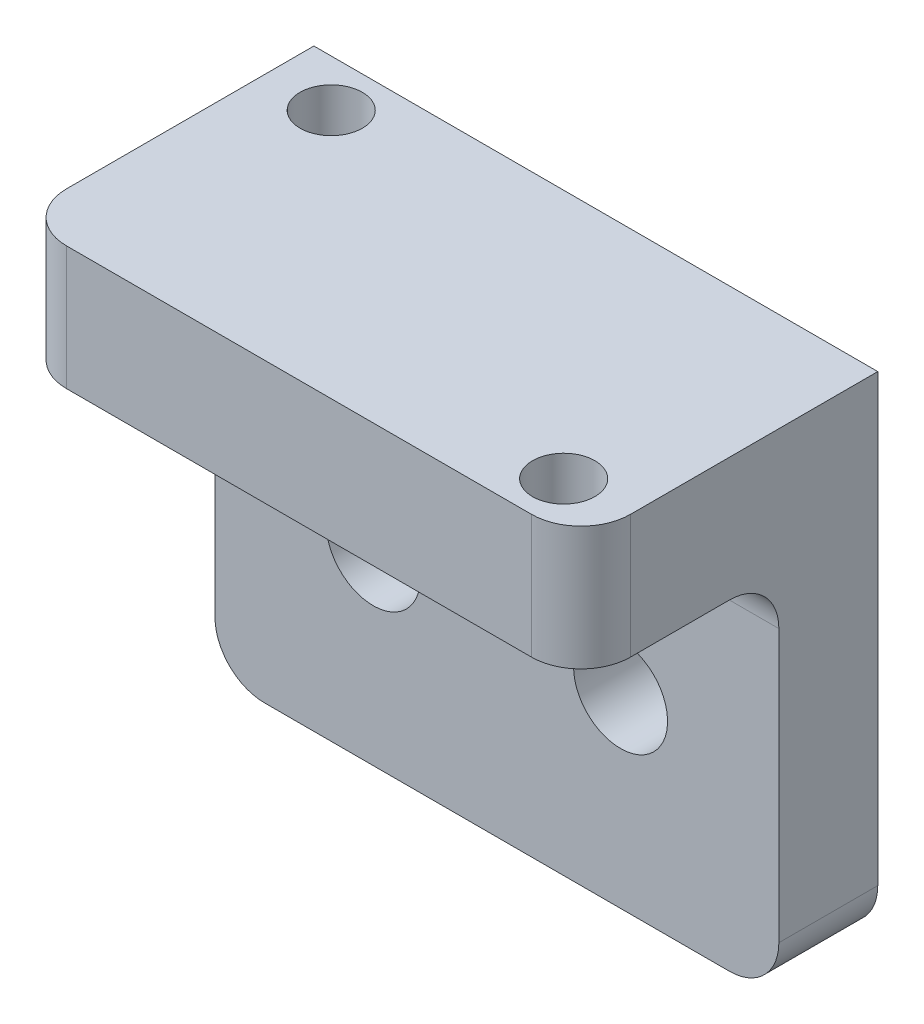
ISO-10303-21;
HEADER;
FILE_DESCRIPTION(('STEP AP214'),'2;1');
FILE_NAME('part.step','',(''),(''),'','','');
FILE_SCHEMA(('AUTOMOTIVE_DESIGN { 1 0 10303 214 1 1 1 1 }'));
ENDSEC;
DATA;
#1=APPLICATION_CONTEXT('core data for automotive mechanical design processes');
#2=APPLICATION_PROTOCOL_DEFINITION('international standard','automotive_design',2000,#1);
#3=PRODUCT_CONTEXT('',#1,'mechanical');
#4=PRODUCT('Part','Part','',(#3));
#5=PRODUCT_RELATED_PRODUCT_CATEGORY('part','',(#4));
#6=PRODUCT_DEFINITION_FORMATION('','',#4);
#7=PRODUCT_DEFINITION_CONTEXT('part definition',#1,'design');
#8=PRODUCT_DEFINITION('design','',#6,#7);
#9=PRODUCT_DEFINITION_SHAPE('','',#8);
#10=(LENGTH_UNIT() NAMED_UNIT(*) SI_UNIT(.MILLI.,.METRE.));
#11=(NAMED_UNIT(*) PLANE_ANGLE_UNIT() SI_UNIT($,.RADIAN.));
#12=(NAMED_UNIT(*) SI_UNIT($,.STERADIAN.) SOLID_ANGLE_UNIT());
#13=UNCERTAINTY_MEASURE_WITH_UNIT(LENGTH_MEASURE(1.E-05),#10,'distance_accuracy_value','');
#14=(GEOMETRIC_REPRESENTATION_CONTEXT(3) GLOBAL_UNCERTAINTY_ASSIGNED_CONTEXT((#13)) GLOBAL_UNIT_ASSIGNED_CONTEXT((#10,
#11,#12)) REPRESENTATION_CONTEXT('',''));
#15=CARTESIAN_POINT('',(0.,0.,0.));
#16=DIRECTION('',(0.,0.,1.));
#17=DIRECTION('',(1.,0.,0.));
#18=AXIS2_PLACEMENT_3D('',#15,#16,#17);
#19=CARTESIAN_POINT('',(0.,-6.35,0.));
#20=DIRECTION('',(0.,-1.,0.));
#21=DIRECTION('',(0.,0.,-1.));
#22=AXIS2_PLACEMENT_3D('',#19,#20,#21);
#23=PLANE('',#22);
#24=CARTESIAN_POINT('',(11.176,-6.35,5.207));
#25=DIRECTION('',(0.,1.,0.));
#26=DIRECTION('',(0.,0.,1.));
#27=AXIS2_PLACEMENT_3D('',#24,#25,#26);
#28=CIRCLE('',#27,1.6002);
#29=CARTESIAN_POINT('',(11.176,-6.35,6.8072));
#30=VERTEX_POINT('',#29);
#31=EDGE_CURVE('E221',#30,#30,#28,.T.);
#32=ORIENTED_EDGE('',*,*,#31,.T.);
#33=EDGE_LOOP('',(#32));
#34=FACE_BOUND('',#33,.T.);
#35=DIRECTION('',(0.,0.,-1.));
#36=VECTOR('',#35,1.);
#37=CARTESIAN_POINT('',(14.478,-6.35,7.62));
#38=LINE('',#37,#36);
#39=CARTESIAN_POINT('',(14.478,-6.35,5.08));
#40=VERTEX_POINT('',#39);
#41=CARTESIAN_POINT('',(14.478,-6.35,0.));
#42=VERTEX_POINT('',#41);
#43=EDGE_CURVE('E154',#40,#42,#38,.T.);
#44=ORIENTED_EDGE('',*,*,#43,.F.);
#45=CARTESIAN_POINT('',(11.938,-6.35,5.08));
#46=DIRECTION('',(0.,-1.,0.));
#47=DIRECTION('',(0.,0.,-1.));
#48=AXIS2_PLACEMENT_3D('',#45,#46,#47);
#49=CIRCLE('',#48,2.54);
#50=CARTESIAN_POINT('',(11.938,-6.35,7.62));
#51=VERTEX_POINT('',#50);
#52=EDGE_CURVE('E51',#40,#51,#49,.T.);
#53=ORIENTED_EDGE('',*,*,#52,.T.);
#54=DIRECTION('',(1.,0.,0.));
#55=VECTOR('',#54,1.);
#56=CARTESIAN_POINT('',(-14.478,-6.35,7.62));
#57=LINE('',#56,#55);
#58=CARTESIAN_POINT('',(-11.938,-6.35,7.62));
#59=VERTEX_POINT('',#58);
#60=EDGE_CURVE('E132',#59,#51,#57,.T.);
#61=ORIENTED_EDGE('',*,*,#60,.F.);
#62=CARTESIAN_POINT('',(-11.938,-6.35,5.08));
#63=DIRECTION('',(0.,-1.,0.));
#64=DIRECTION('',(0.,0.,-1.));
#65=AXIS2_PLACEMENT_3D('',#62,#63,#64);
#66=CIRCLE('',#65,2.54);
#67=CARTESIAN_POINT('',(-14.478,-6.35,5.08));
#68=VERTEX_POINT('',#67);
#69=EDGE_CURVE('E189',#59,#68,#66,.T.);
#70=ORIENTED_EDGE('',*,*,#69,.T.);
#71=DIRECTION('',(0.,0.,1.));
#72=VECTOR('',#71,1.);
#73=CARTESIAN_POINT('',(-14.478,-6.35,7.62));
#74=LINE('',#73,#72);
#75=CARTESIAN_POINT('',(-14.478,-6.35,0.));
#76=VERTEX_POINT('',#75);
#77=EDGE_CURVE('E211',#76,#68,#74,.T.);
#78=ORIENTED_EDGE('',*,*,#77,.F.);
#79=DIRECTION('',(1.,0.,0.));
#80=VECTOR('',#79,1.);
#81=CARTESIAN_POINT('',(0.,-6.35,0.));
#82=LINE('',#81,#80);
#83=EDGE_CURVE('E186',#76,#42,#82,.T.);
#84=ORIENTED_EDGE('',*,*,#83,.T.);
#85=EDGE_LOOP('',(#44,#53,#61,#70,#78,#84));
#86=FACE_BOUND('',#85,.T.);
#87=ADVANCED_FACE('F36',(#34,#86),#23,.T.);
#88=CARTESIAN_POINT('',(14.478,-6.35,7.62));
#89=DIRECTION('',(1.,0.,0.));
#90=DIRECTION('',(0.,0.,-1.));
#91=AXIS2_PLACEMENT_3D('',#88,#89,#90);
#92=PLANE('',#91);
#93=DIRECTION('',(0.,-1.,0.));
#94=VECTOR('',#93,1.);
#95=CARTESIAN_POINT('',(14.478,-6.35,-2.54));
#96=LINE('',#95,#94);
#97=CARTESIAN_POINT('',(14.478,-8.89,-2.54));
#98=VERTEX_POINT('',#97);
#99=CARTESIAN_POINT('',(14.478,-22.86,-2.54));
#100=VERTEX_POINT('',#99);
#101=EDGE_CURVE('E193',#98,#100,#96,.T.);
#102=ORIENTED_EDGE('',*,*,#101,.T.);
#103=DIRECTION('',(0.,0.,-1.));
#104=VECTOR('',#103,1.);
#105=CARTESIAN_POINT('',(14.478,-22.86,7.62));
#106=LINE('',#105,#104);
#107=CARTESIAN_POINT('',(14.478,-22.86,-7.62));
#108=VERTEX_POINT('',#107);
#109=EDGE_CURVE('E128',#100,#108,#106,.T.);
#110=ORIENTED_EDGE('',*,*,#109,.T.);
#111=DIRECTION('',(0.,1.,0.));
#112=VECTOR('',#111,1.);
#113=CARTESIAN_POINT('',(14.478,-6.35,-7.62));
#114=LINE('',#113,#112);
#115=CARTESIAN_POINT('',(14.478,0.,-7.62));
#116=VERTEX_POINT('',#115);
#117=EDGE_CURVE('E121',#108,#116,#114,.T.);
#118=ORIENTED_EDGE('',*,*,#117,.T.);
#119=DIRECTION('',(0.,0.,-1.));
#120=VECTOR('',#119,1.);
#121=CARTESIAN_POINT('',(14.478,0.,7.62));
#122=LINE('',#121,#120);
#123=CARTESIAN_POINT('',(14.478,0.,5.08));
#124=VERTEX_POINT('',#123);
#125=EDGE_CURVE('E125',#124,#116,#122,.T.);
#126=ORIENTED_EDGE('',*,*,#125,.F.);
#127=DIRECTION('',(0.,1.,0.));
#128=VECTOR('',#127,1.);
#129=CARTESIAN_POINT('',(14.478,-6.35,5.08));
#130=LINE('',#129,#128);
#131=EDGE_CURVE('E155',#124,#40,#130,.F.);
#132=ORIENTED_EDGE('',*,*,#131,.T.);
#133=ORIENTED_EDGE('',*,*,#43,.T.);
#134=CARTESIAN_POINT('',(14.478,-8.89,0.));
#135=DIRECTION('',(1.,0.,0.));
#136=DIRECTION('',(0.,0.,-1.));
#137=AXIS2_PLACEMENT_3D('',#134,#135,#136);
#138=CIRCLE('',#137,2.54);
#139=EDGE_CURVE('E44',#42,#98,#138,.F.);
#140=ORIENTED_EDGE('',*,*,#139,.T.);
#141=EDGE_LOOP('',(#102,#110,#118,#126,#132,#133,#140));
#142=FACE_BOUND('',#141,.T.);
#143=ADVANCED_FACE('F124',(#142),#92,.T.);
#144=CARTESIAN_POINT('',(-14.478,-6.35,7.62));
#145=DIRECTION('',(0.,0.,1.));
#146=DIRECTION('',(1.,0.,0.));
#147=AXIS2_PLACEMENT_3D('',#144,#145,#146);
#148=PLANE('',#147);
#149=ORIENTED_EDGE('',*,*,#60,.T.);
#150=DIRECTION('',(0.,1.,0.));
#151=VECTOR('',#150,1.);
#152=CARTESIAN_POINT('',(11.938,-6.35,7.62));
#153=LINE('',#152,#151);
#154=CARTESIAN_POINT('',(11.938,0.,7.62));
#155=VERTEX_POINT('',#154);
#156=EDGE_CURVE('E180',#51,#155,#153,.T.);
#157=ORIENTED_EDGE('',*,*,#156,.T.);
#158=DIRECTION('',(1.,0.,0.));
#159=VECTOR('',#158,1.);
#160=CARTESIAN_POINT('',(-14.478,0.,7.62));
#161=LINE('',#160,#159);
#162=CARTESIAN_POINT('',(-11.938,0.,7.62));
#163=VERTEX_POINT('',#162);
#164=EDGE_CURVE('E149',#163,#155,#161,.T.);
#165=ORIENTED_EDGE('',*,*,#164,.F.);
#166=DIRECTION('',(0.,1.,0.));
#167=VECTOR('',#166,1.);
#168=CARTESIAN_POINT('',(-11.938,-6.35,7.62));
#169=LINE('',#168,#167);
#170=EDGE_CURVE('E58',#163,#59,#169,.F.);
#171=ORIENTED_EDGE('',*,*,#170,.T.);
#172=EDGE_LOOP('',(#149,#157,#165,#171));
#173=FACE_BOUND('',#172,.T.);
#174=ADVANCED_FACE('F276',(#173),#148,.T.);
#175=CARTESIAN_POINT('',(-14.478,-6.35,7.62));
#176=DIRECTION('',(-1.,0.,0.));
#177=DIRECTION('',(0.,0.,1.));
#178=AXIS2_PLACEMENT_3D('',#175,#176,#177);
#179=PLANE('',#178);
#180=DIRECTION('',(0.,1.,0.));
#181=VECTOR('',#180,1.);
#182=CARTESIAN_POINT('',(-14.478,-6.35,-7.62));
#183=LINE('',#182,#181);
#184=CARTESIAN_POINT('',(-14.478,-22.86,-7.62));
#185=VERTEX_POINT('',#184);
#186=CARTESIAN_POINT('',(-14.478,0.,-7.62));
#187=VERTEX_POINT('',#186);
#188=EDGE_CURVE('E131',#185,#187,#183,.T.);
#189=ORIENTED_EDGE('',*,*,#188,.F.);
#190=DIRECTION('',(0.,0.,-1.));
#191=VECTOR('',#190,1.);
#192=CARTESIAN_POINT('',(-14.478,-22.86,7.62));
#193=LINE('',#192,#191);
#194=CARTESIAN_POINT('',(-14.478,-22.86,-2.54));
#195=VERTEX_POINT('',#194);
#196=EDGE_CURVE('E177',#185,#195,#193,.F.);
#197=ORIENTED_EDGE('',*,*,#196,.T.);
#198=DIRECTION('',(0.,1.,0.));
#199=VECTOR('',#198,1.);
#200=CARTESIAN_POINT('',(-14.478,-6.35,-2.54));
#201=LINE('',#200,#199);
#202=CARTESIAN_POINT('',(-14.478,-8.89,-2.54));
#203=VERTEX_POINT('',#202);
#204=EDGE_CURVE('E213',#195,#203,#201,.T.);
#205=ORIENTED_EDGE('',*,*,#204,.T.);
#206=CARTESIAN_POINT('',(-14.478,-8.89,0.));
#207=DIRECTION('',(-1.,0.,0.));
#208=DIRECTION('',(0.,0.,1.));
#209=AXIS2_PLACEMENT_3D('',#206,#207,#208);
#210=CIRCLE('',#209,2.54);
#211=EDGE_CURVE('E11',#203,#76,#210,.F.);
#212=ORIENTED_EDGE('',*,*,#211,.T.);
#213=ORIENTED_EDGE('',*,*,#77,.T.);
#214=DIRECTION('',(0.,1.,0.));
#215=VECTOR('',#214,1.);
#216=CARTESIAN_POINT('',(-14.478,-6.35,5.08));
#217=LINE('',#216,#215);
#218=CARTESIAN_POINT('',(-14.478,0.,5.08));
#219=VERTEX_POINT('',#218);
#220=EDGE_CURVE('E174',#68,#219,#217,.T.);
#221=ORIENTED_EDGE('',*,*,#220,.T.);
#222=DIRECTION('',(0.,0.,1.));
#223=VECTOR('',#222,1.);
#224=CARTESIAN_POINT('',(-14.478,0.,7.62));
#225=LINE('',#224,#223);
#226=EDGE_CURVE('E147',#187,#219,#225,.T.);
#227=ORIENTED_EDGE('',*,*,#226,.F.);
#228=EDGE_LOOP('',(#189,#197,#205,#212,#213,#221,#227));
#229=FACE_BOUND('',#228,.T.);
#230=ADVANCED_FACE('F210',(#229),#179,.T.);
#231=CARTESIAN_POINT('',(-14.478,-6.35,-7.62));
#232=DIRECTION('',(0.,0.,-1.));
#233=DIRECTION('',(-1.,0.,0.));
#234=AXIS2_PLACEMENT_3D('',#231,#232,#233);
#235=PLANE('',#234);
#236=ORIENTED_EDGE('',*,*,#117,.F.);
#237=CARTESIAN_POINT('',(11.938,-22.86,-7.62));
#238=DIRECTION('',(0.,0.,-1.));
#239=DIRECTION('',(-1.,0.,0.));
#240=AXIS2_PLACEMENT_3D('',#237,#238,#239);
#241=CIRCLE('',#240,2.54);
#242=CARTESIAN_POINT('',(11.938,-25.4,-7.62));
#243=VERTEX_POINT('',#242);
#244=EDGE_CURVE('E161',#108,#243,#241,.T.);
#245=ORIENTED_EDGE('',*,*,#244,.T.);
#246=DIRECTION('',(-1.,0.,0.));
#247=VECTOR('',#246,1.);
#248=CARTESIAN_POINT('',(14.478,-25.4,-7.62));
#249=LINE('',#248,#247);
#250=CARTESIAN_POINT('',(-11.938,-25.4,-7.62));
#251=VERTEX_POINT('',#250);
#252=EDGE_CURVE('E204',#243,#251,#249,.T.);
#253=ORIENTED_EDGE('',*,*,#252,.T.);
#254=CARTESIAN_POINT('',(-11.938,-22.86,-7.62));
#255=DIRECTION('',(0.,0.,-1.));
#256=DIRECTION('',(-1.,0.,0.));
#257=AXIS2_PLACEMENT_3D('',#254,#255,#256);
#258=CIRCLE('',#257,2.54);
#259=EDGE_CURVE('E159',#251,#185,#258,.T.);
#260=ORIENTED_EDGE('',*,*,#259,.T.);
#261=ORIENTED_EDGE('',*,*,#188,.T.);
#262=DIRECTION('',(-1.,0.,0.));
#263=VECTOR('',#262,1.);
#264=CARTESIAN_POINT('',(-14.478,0.,-7.62));
#265=LINE('',#264,#263);
#266=EDGE_CURVE('E139',#116,#187,#265,.T.);
#267=ORIENTED_EDGE('',*,*,#266,.F.);
#268=EDGE_LOOP('',(#236,#245,#253,#260,#261,#267));
#269=FACE_BOUND('',#268,.T.);
#270=CARTESIAN_POINT('',(-6.35,-15.875,-7.62));
#271=DIRECTION('',(0.,0.,-1.));
#272=DIRECTION('',(-1.,0.,0.));
#273=AXIS2_PLACEMENT_3D('',#270,#271,#272);
#274=CIRCLE('',#273,2.413);
#275=CARTESIAN_POINT('',(-8.763,-15.875,-7.62));
#276=VERTEX_POINT('',#275);
#277=EDGE_CURVE('E241',#276,#276,#274,.T.);
#278=ORIENTED_EDGE('',*,*,#277,.F.);
#279=EDGE_LOOP('',(#278));
#280=FACE_BOUND('',#279,.T.);
#281=CARTESIAN_POINT('',(6.35,-15.875,-7.62));
#282=DIRECTION('',(0.,0.,-1.));
#283=DIRECTION('',(-1.,0.,0.));
#284=AXIS2_PLACEMENT_3D('',#281,#282,#283);
#285=CIRCLE('',#284,2.413);
#286=CARTESIAN_POINT('',(3.937,-15.875,-7.62));
#287=VERTEX_POINT('',#286);
#288=EDGE_CURVE('E235',#287,#287,#285,.T.);
#289=ORIENTED_EDGE('',*,*,#288,.F.);
#290=EDGE_LOOP('',(#289));
#291=FACE_BOUND('',#290,.T.);
#292=ADVANCED_FACE('F143',(#269,#280,#291),#235,.T.);
#293=CARTESIAN_POINT('',(0.,0.,0.));
#294=DIRECTION('',(0.,-1.,0.));
#295=DIRECTION('',(0.,0.,-1.));
#296=AXIS2_PLACEMENT_3D('',#293,#294,#295);
#297=PLANE('',#296);
#298=CARTESIAN_POINT('',(11.176,0.,5.207));
#299=DIRECTION('',(0.,1.,0.));
#300=DIRECTION('',(0.,0.,1.));
#301=AXIS2_PLACEMENT_3D('',#298,#299,#300);
#302=CIRCLE('',#301,1.6002);
#303=CARTESIAN_POINT('',(11.176,0.,6.8072));
#304=VERTEX_POINT('',#303);
#305=EDGE_CURVE('E224',#304,#304,#302,.T.);
#306=ORIENTED_EDGE('',*,*,#305,.F.);
#307=EDGE_LOOP('',(#306));
#308=FACE_BOUND('',#307,.T.);
#309=CARTESIAN_POINT('',(-11.176,0.,-5.207));
#310=DIRECTION('',(0.,1.,0.));
#311=DIRECTION('',(0.,0.,1.));
#312=AXIS2_PLACEMENT_3D('',#309,#310,#311);
#313=CIRCLE('',#312,1.6002);
#314=CARTESIAN_POINT('',(-11.176,0.,-3.6068));
#315=VERTEX_POINT('',#314);
#316=EDGE_CURVE('E218',#315,#315,#313,.T.);
#317=ORIENTED_EDGE('',*,*,#316,.F.);
#318=EDGE_LOOP('',(#317));
#319=FACE_BOUND('',#318,.T.);
#320=ORIENTED_EDGE('',*,*,#164,.T.);
#321=CARTESIAN_POINT('',(11.938,0.,5.08));
#322=DIRECTION('',(0.,-1.,0.));
#323=DIRECTION('',(0.,0.,-1.));
#324=AXIS2_PLACEMENT_3D('',#321,#322,#323);
#325=CIRCLE('',#324,2.54);
#326=EDGE_CURVE('E140',#155,#124,#325,.F.);
#327=ORIENTED_EDGE('',*,*,#326,.T.);
#328=ORIENTED_EDGE('',*,*,#125,.T.);
#329=ORIENTED_EDGE('',*,*,#266,.T.);
#330=ORIENTED_EDGE('',*,*,#226,.T.);
#331=CARTESIAN_POINT('',(-11.938,0.,5.08));
#332=DIRECTION('',(0.,-1.,0.));
#333=DIRECTION('',(0.,0.,-1.));
#334=AXIS2_PLACEMENT_3D('',#331,#332,#333);
#335=CIRCLE('',#334,2.54);
#336=EDGE_CURVE('E183',#219,#163,#335,.F.);
#337=ORIENTED_EDGE('',*,*,#336,.T.);
#338=EDGE_LOOP('',(#320,#327,#328,#329,#330,#337));
#339=FACE_BOUND('',#338,.T.);
#340=ADVANCED_FACE('F137',(#308,#319,#339),#297,.F.);
#341=CARTESIAN_POINT('',(-11.176,-6.35,-5.207));
#342=DIRECTION('',(0.,1.,0.));
#343=DIRECTION('',(0.,0.,1.));
#344=AXIS2_PLACEMENT_3D('',#341,#342,#343);
#345=CYLINDRICAL_SURFACE('',#344,1.6002);
#346=CARTESIAN_POINT('',(-11.176,-6.35,-5.207));
#347=DIRECTION('',(0.,1.,0.));
#348=DIRECTION('',(0.,0.,1.));
#349=AXIS2_PLACEMENT_3D('',#346,#347,#348);
#350=CIRCLE('',#349,1.6002);
#351=CARTESIAN_POINT('',(-11.176,-6.35,-3.6068));
#352=VERTEX_POINT('',#351);
#353=EDGE_CURVE('E141',#352,#352,#350,.T.);
#354=ORIENTED_EDGE('',*,*,#353,.F.);
#355=EDGE_LOOP('',(#354));
#356=FACE_BOUND('',#355,.T.);
#357=ORIENTED_EDGE('',*,*,#316,.T.);
#358=EDGE_LOOP('',(#357));
#359=FACE_BOUND('',#358,.T.);
#360=ADVANCED_FACE('F280',(#356,#359),#345,.F.);
#361=CARTESIAN_POINT('',(11.176,-6.35,5.207));
#362=DIRECTION('',(0.,1.,0.));
#363=DIRECTION('',(0.,0.,1.));
#364=AXIS2_PLACEMENT_3D('',#361,#362,#363);
#365=CYLINDRICAL_SURFACE('',#364,1.6002);
#366=ORIENTED_EDGE('',*,*,#31,.F.);
#367=EDGE_LOOP('',(#366));
#368=FACE_BOUND('',#367,.T.);
#369=ORIENTED_EDGE('',*,*,#305,.T.);
#370=EDGE_LOOP('',(#369));
#371=FACE_BOUND('',#370,.T.);
#372=ADVANCED_FACE('F253',(#368,#371),#365,.F.);
#373=CARTESIAN_POINT('',(-6.35,-15.875,-2.54));
#374=DIRECTION('',(0.,0.,-1.));
#375=DIRECTION('',(-1.,0.,0.));
#376=AXIS2_PLACEMENT_3D('',#373,#374,#375);
#377=CYLINDRICAL_SURFACE('',#376,2.413);
#378=CARTESIAN_POINT('',(-6.35,-15.875,-2.54));
#379=DIRECTION('',(0.,0.,-1.));
#380=DIRECTION('',(-1.,0.,0.));
#381=AXIS2_PLACEMENT_3D('',#378,#379,#380);
#382=CIRCLE('',#381,2.413);
#383=CARTESIAN_POINT('',(-8.763,-15.875,-2.54));
#384=VERTEX_POINT('',#383);
#385=EDGE_CURVE('E238',#384,#384,#382,.T.);
#386=ORIENTED_EDGE('',*,*,#385,.F.);
#387=EDGE_LOOP('',(#386));
#388=FACE_BOUND('',#387,.T.);
#389=ORIENTED_EDGE('',*,*,#277,.T.);
#390=EDGE_LOOP('',(#389));
#391=FACE_BOUND('',#390,.T.);
#392=ADVANCED_FACE('F249',(#388,#391),#377,.F.);
#393=CARTESIAN_POINT('',(6.35,-15.875,-2.54));
#394=DIRECTION('',(0.,0.,-1.));
#395=DIRECTION('',(-1.,0.,0.));
#396=AXIS2_PLACEMENT_3D('',#393,#394,#395);
#397=CYLINDRICAL_SURFACE('',#396,2.413);
#398=CARTESIAN_POINT('',(6.35,-15.875,-2.54));
#399=DIRECTION('',(0.,0.,-1.));
#400=DIRECTION('',(-1.,0.,0.));
#401=AXIS2_PLACEMENT_3D('',#398,#399,#400);
#402=CIRCLE('',#401,2.413);
#403=CARTESIAN_POINT('',(3.937,-15.875,-2.54));
#404=VERTEX_POINT('',#403);
#405=EDGE_CURVE('E231',#404,#404,#402,.T.);
#406=ORIENTED_EDGE('',*,*,#405,.F.);
#407=EDGE_LOOP('',(#406));
#408=FACE_BOUND('',#407,.T.);
#409=ORIENTED_EDGE('',*,*,#288,.T.);
#410=EDGE_LOOP('',(#409));
#411=FACE_BOUND('',#410,.T.);
#412=ADVANCED_FACE('F252',(#408,#411),#397,.F.);
#413=CARTESIAN_POINT('',(0.,0.,-2.54));
#414=DIRECTION('',(0.,0.,-1.));
#415=DIRECTION('',(-1.,0.,0.));
#416=AXIS2_PLACEMENT_3D('',#413,#414,#415);
#417=PLANE('',#416);
#418=ORIENTED_EDGE('',*,*,#385,.T.);
#419=EDGE_LOOP('',(#418));
#420=FACE_BOUND('',#419,.T.);
#421=ORIENTED_EDGE('',*,*,#405,.T.);
#422=EDGE_LOOP('',(#421));
#423=FACE_BOUND('',#422,.T.);
#424=DIRECTION('',(-1.,0.,0.));
#425=VECTOR('',#424,1.);
#426=CARTESIAN_POINT('',(14.478,-25.4,-2.54));
#427=LINE('',#426,#425);
#428=CARTESIAN_POINT('',(11.938,-25.4,-2.54));
#429=VERTEX_POINT('',#428);
#430=CARTESIAN_POINT('',(-11.938,-25.4,-2.54));
#431=VERTEX_POINT('',#430);
#432=EDGE_CURVE('E203',#429,#431,#427,.T.);
#433=ORIENTED_EDGE('',*,*,#432,.F.);
#434=CARTESIAN_POINT('',(11.938,-22.86,-2.54));
#435=DIRECTION('',(0.,0.,-1.));
#436=DIRECTION('',(-1.,0.,0.));
#437=AXIS2_PLACEMENT_3D('',#434,#435,#436);
#438=CIRCLE('',#437,2.54);
#439=EDGE_CURVE('E172',#429,#100,#438,.F.);
#440=ORIENTED_EDGE('',*,*,#439,.T.);
#441=ORIENTED_EDGE('',*,*,#101,.F.);
#442=DIRECTION('',(1.,0.,0.));
#443=VECTOR('',#442,1.);
#444=CARTESIAN_POINT('',(0.,-8.89,-2.54));
#445=LINE('',#444,#443);
#446=EDGE_CURVE('E168',#98,#203,#445,.F.);
#447=ORIENTED_EDGE('',*,*,#446,.T.);
#448=ORIENTED_EDGE('',*,*,#204,.F.);
#449=CARTESIAN_POINT('',(-11.938,-22.86,-2.54));
#450=DIRECTION('',(0.,0.,-1.));
#451=DIRECTION('',(-1.,0.,0.));
#452=AXIS2_PLACEMENT_3D('',#449,#450,#451);
#453=CIRCLE('',#452,2.54);
#454=EDGE_CURVE('E170',#195,#431,#453,.F.);
#455=ORIENTED_EDGE('',*,*,#454,.T.);
#456=EDGE_LOOP('',(#433,#440,#441,#447,#448,#455));
#457=FACE_BOUND('',#456,.T.);
#458=ADVANCED_FACE('F199',(#420,#423,#457),#417,.F.);
#459=CARTESIAN_POINT('',(14.478,-25.4,-2.54));
#460=DIRECTION('',(0.,-1.,0.));
#461=DIRECTION('',(0.,0.,-1.));
#462=AXIS2_PLACEMENT_3D('',#459,#460,#461);
#463=PLANE('',#462);
#464=ORIENTED_EDGE('',*,*,#252,.F.);
#465=DIRECTION('',(0.,0.,-1.));
#466=VECTOR('',#465,1.);
#467=CARTESIAN_POINT('',(11.938,-25.4,-2.54));
#468=LINE('',#467,#466);
#469=EDGE_CURVE('E166',#243,#429,#468,.F.);
#470=ORIENTED_EDGE('',*,*,#469,.T.);
#471=ORIENTED_EDGE('',*,*,#432,.T.);
#472=DIRECTION('',(0.,0.,-1.));
#473=VECTOR('',#472,1.);
#474=CARTESIAN_POINT('',(-11.938,-25.4,-2.54));
#475=LINE('',#474,#473);
#476=EDGE_CURVE('E163',#431,#251,#475,.T.);
#477=ORIENTED_EDGE('',*,*,#476,.T.);
#478=EDGE_LOOP('',(#464,#470,#471,#477));
#479=FACE_BOUND('',#478,.T.);
#480=ADVANCED_FACE('F267',(#479),#463,.T.);
#481=CARTESIAN_POINT('',(14.478,-6.35,-2.54));
#482=DIRECTION('',(0.,1.,0.));
#483=DIRECTION('',(0.,0.,1.));
#484=AXIS2_PLACEMENT_3D('',#481,#482,#483);
#485=PLANE('',#484);
#486=ORIENTED_EDGE('',*,*,#353,.T.);
#487=EDGE_LOOP('',(#486));
#488=FACE_BOUND('',#487,.T.);
#489=ADVANCED_FACE('F293',(#488),#485,.T.);
#490=CARTESIAN_POINT('',(11.938,-22.86,7.62));
#491=DIRECTION('',(0.,0.,-1.));
#492=DIRECTION('',(-1.,0.,0.));
#493=AXIS2_PLACEMENT_3D('',#490,#491,#492);
#494=CYLINDRICAL_SURFACE('',#493,2.54);
#495=ORIENTED_EDGE('',*,*,#439,.F.);
#496=ORIENTED_EDGE('',*,*,#469,.F.);
#497=ORIENTED_EDGE('',*,*,#244,.F.);
#498=ORIENTED_EDGE('',*,*,#109,.F.);
#499=EDGE_LOOP('',(#495,#496,#497,#498));
#500=FACE_BOUND('',#499,.T.);
#501=ADVANCED_FACE('F289',(#500),#494,.T.);
#502=CARTESIAN_POINT('',(-11.938,-22.86,-2.54));
#503=DIRECTION('',(0.,0.,-1.));
#504=DIRECTION('',(-1.,0.,0.));
#505=AXIS2_PLACEMENT_3D('',#502,#503,#504);
#506=CYLINDRICAL_SURFACE('',#505,2.54);
#507=ORIENTED_EDGE('',*,*,#454,.F.);
#508=ORIENTED_EDGE('',*,*,#196,.F.);
#509=ORIENTED_EDGE('',*,*,#259,.F.);
#510=ORIENTED_EDGE('',*,*,#476,.F.);
#511=EDGE_LOOP('',(#507,#508,#509,#510));
#512=FACE_BOUND('',#511,.T.);
#513=ADVANCED_FACE('F292',(#512),#506,.T.);
#514=CARTESIAN_POINT('',(11.938,-6.35,5.08));
#515=DIRECTION('',(0.,1.,0.));
#516=DIRECTION('',(0.,0.,1.));
#517=AXIS2_PLACEMENT_3D('',#514,#515,#516);
#518=CYLINDRICAL_SURFACE('',#517,2.54);
#519=ORIENTED_EDGE('',*,*,#52,.F.);
#520=ORIENTED_EDGE('',*,*,#131,.F.);
#521=ORIENTED_EDGE('',*,*,#326,.F.);
#522=ORIENTED_EDGE('',*,*,#156,.F.);
#523=EDGE_LOOP('',(#519,#520,#521,#522));
#524=FACE_BOUND('',#523,.T.);
#525=ADVANCED_FACE('F297',(#524),#518,.T.);
#526=CARTESIAN_POINT('',(-11.938,-6.35,5.08));
#527=DIRECTION('',(0.,1.,0.));
#528=DIRECTION('',(0.,0.,1.));
#529=AXIS2_PLACEMENT_3D('',#526,#527,#528);
#530=CYLINDRICAL_SURFACE('',#529,2.54);
#531=ORIENTED_EDGE('',*,*,#69,.F.);
#532=ORIENTED_EDGE('',*,*,#170,.F.);
#533=ORIENTED_EDGE('',*,*,#336,.F.);
#534=ORIENTED_EDGE('',*,*,#220,.F.);
#535=EDGE_LOOP('',(#531,#532,#533,#534));
#536=FACE_BOUND('',#535,.T.);
#537=ADVANCED_FACE('F300',(#536),#530,.T.);
#538=CARTESIAN_POINT('',(0.,-8.89,0.));
#539=DIRECTION('',(1.,0.,0.));
#540=DIRECTION('',(0.,0.,-1.));
#541=AXIS2_PLACEMENT_3D('',#538,#539,#540);
#542=CYLINDRICAL_SURFACE('',#541,2.54);
#543=ORIENTED_EDGE('',*,*,#211,.F.);
#544=ORIENTED_EDGE('',*,*,#446,.F.);
#545=ORIENTED_EDGE('',*,*,#139,.F.);
#546=ORIENTED_EDGE('',*,*,#83,.F.);
#547=EDGE_LOOP('',(#543,#544,#545,#546));
#548=FACE_BOUND('',#547,.T.);
#549=ADVANCED_FACE('F38',(#548),#542,.F.);
#550=CLOSED_SHELL('',(#87,#143,#174,#230,#292,#340,#360,#372,#392,#412,#458,#480,#489,#501,#513,
#525,#537,#549));
#551=MANIFOLD_SOLID_BREP('B2',#550);
#552=ADVANCED_BREP_SHAPE_REPRESENTATION('',(#18,#551),#14);
#553=SHAPE_DEFINITION_REPRESENTATION(#9,#552);
ENDSEC;
END-ISO-10303-21;
